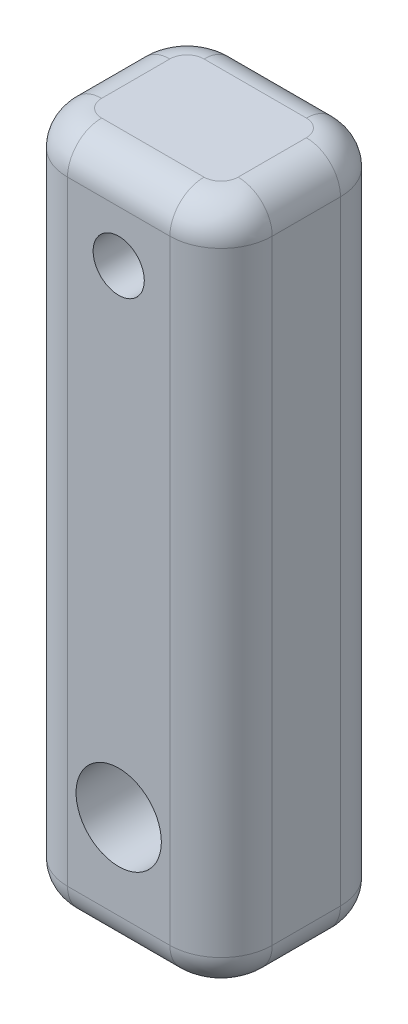
ISO-10303-21;
HEADER;
FILE_DESCRIPTION(('STEP AP214'),'2;1');
FILE_NAME('part.step','',(''),(''),'','','');
FILE_SCHEMA(('AUTOMOTIVE_DESIGN { 1 0 10303 214 1 1 1 1 }'));
ENDSEC;
DATA;
#1=APPLICATION_CONTEXT('core data for automotive mechanical design processes');
#2=APPLICATION_PROTOCOL_DEFINITION('international standard','automotive_design',2000,#1);
#3=PRODUCT_CONTEXT('',#1,'mechanical');
#4=PRODUCT('Part','Part','',(#3));
#5=PRODUCT_RELATED_PRODUCT_CATEGORY('part','',(#4));
#6=PRODUCT_DEFINITION_FORMATION('','',#4);
#7=PRODUCT_DEFINITION_CONTEXT('part definition',#1,'design');
#8=PRODUCT_DEFINITION('design','',#6,#7);
#9=PRODUCT_DEFINITION_SHAPE('','',#8);
#10=(LENGTH_UNIT() NAMED_UNIT(*) SI_UNIT(.MILLI.,.METRE.));
#11=(NAMED_UNIT(*) PLANE_ANGLE_UNIT() SI_UNIT($,.RADIAN.));
#12=(NAMED_UNIT(*) SI_UNIT($,.STERADIAN.) SOLID_ANGLE_UNIT());
#13=UNCERTAINTY_MEASURE_WITH_UNIT(LENGTH_MEASURE(1.E-05),#10,'distance_accuracy_value','');
#14=(GEOMETRIC_REPRESENTATION_CONTEXT(3) GLOBAL_UNCERTAINTY_ASSIGNED_CONTEXT((#13)) GLOBAL_UNIT_ASSIGNED_CONTEXT((#10,
#11,#12)) REPRESENTATION_CONTEXT('',''));
#15=CARTESIAN_POINT('',(0.,0.,0.));
#16=DIRECTION('',(0.,0.,1.));
#17=DIRECTION('',(1.,0.,0.));
#18=AXIS2_PLACEMENT_3D('',#15,#16,#17);
#19=CARTESIAN_POINT('',(-7.62,101.6,5.08));
#20=DIRECTION('',(0.,-1.,0.));
#21=DIRECTION('',(0.,0.,-1.));
#22=AXIS2_PLACEMENT_3D('',#19,#20,#21);
#23=CYLINDRICAL_SURFACE('',#22,7.62);
#24=DIRECTION('',(0.,-1.,0.));
#25=VECTOR('',#24,1.);
#26=CARTESIAN_POINT('',(-7.62,101.6,12.7));
#27=LINE('',#26,#25);
#28=CARTESIAN_POINT('',(-7.62,96.5199999999999,12.7));
#29=VERTEX_POINT('',#28);
#30=CARTESIAN_POINT('',(-7.62,5.07999999999997,12.7));
#31=VERTEX_POINT('',#30);
#32=EDGE_CURVE('E158',#29,#31,#27,.T.);
#33=ORIENTED_EDGE('',*,*,#32,.F.);
#34=CARTESIAN_POINT('',(-7.62,96.5199999999999,5.08));
#35=DIRECTION('',(0.,1.,0.));
#36=DIRECTION('',(0.,0.,1.));
#37=AXIS2_PLACEMENT_3D('',#34,#35,#36);
#38=CIRCLE('',#37,7.62);
#39=CARTESIAN_POINT('',(-15.24,96.5199999999999,5.08));
#40=VERTEX_POINT('',#39);
#41=EDGE_CURVE('E13',#29,#40,#38,.F.);
#42=ORIENTED_EDGE('',*,*,#41,.T.);
#43=DIRECTION('',(0.,-1.,0.));
#44=VECTOR('',#43,1.);
#45=CARTESIAN_POINT('',(-15.24,101.6,5.08));
#46=LINE('',#45,#44);
#47=CARTESIAN_POINT('',(-15.24,5.07999999999997,5.08));
#48=VERTEX_POINT('',#47);
#49=EDGE_CURVE('E189',#40,#48,#46,.T.);
#50=ORIENTED_EDGE('',*,*,#49,.T.);
#51=CARTESIAN_POINT('',(-7.62,5.07999999999997,5.08));
#52=DIRECTION('',(0.,1.,0.));
#53=DIRECTION('',(0.,0.,1.));
#54=AXIS2_PLACEMENT_3D('',#51,#52,#53);
#55=CIRCLE('',#54,7.62);
#56=EDGE_CURVE('E167',#48,#31,#55,.T.);
#57=ORIENTED_EDGE('',*,*,#56,.T.);
#58=EDGE_LOOP('',(#33,#42,#50,#57));
#59=FACE_BOUND('',#58,.T.);
#60=ADVANCED_FACE('F46',(#59),#23,.T.);
#61=CARTESIAN_POINT('',(-7.62,101.6,12.7));
#62=DIRECTION('',(0.,0.,-1.));
#63=DIRECTION('',(-1.,0.,0.));
#64=AXIS2_PLACEMENT_3D('',#61,#62,#63);
#65=PLANE('',#64);
#66=CARTESIAN_POINT('',(0.,88.8999999999999,12.7));
#67=DIRECTION('',(0.,0.,1.));
#68=DIRECTION('',(1.,0.,0.));
#69=AXIS2_PLACEMENT_3D('',#66,#67,#68);
#70=CIRCLE('',#69,3.81);
#71=CARTESIAN_POINT('',(3.81,88.8999999999999,12.7));
#72=VERTEX_POINT('',#71);
#73=EDGE_CURVE('E243',#72,#72,#70,.T.);
#74=ORIENTED_EDGE('',*,*,#73,.F.);
#75=EDGE_LOOP('',(#74));
#76=FACE_BOUND('',#75,.T.);
#77=CARTESIAN_POINT('',(0.,17.78,12.7));
#78=DIRECTION('',(0.,0.,1.));
#79=DIRECTION('',(1.,0.,0.));
#80=AXIS2_PLACEMENT_3D('',#77,#78,#79);
#81=CIRCLE('',#80,6.35);
#82=CARTESIAN_POINT('',(6.35,17.78,12.7));
#83=VERTEX_POINT('',#82);
#84=EDGE_CURVE('E321',#83,#83,#81,.T.);
#85=ORIENTED_EDGE('',*,*,#84,.F.);
#86=EDGE_LOOP('',(#85));
#87=FACE_BOUND('',#86,.T.);
#88=DIRECTION('',(0.,-1.,0.));
#89=VECTOR('',#88,1.);
#90=CARTESIAN_POINT('',(7.61999999999999,101.6,12.7));
#91=LINE('',#90,#89);
#92=CARTESIAN_POINT('',(7.61999999999999,96.5199999999999,12.7));
#93=VERTEX_POINT('',#92);
#94=CARTESIAN_POINT('',(7.61999999999999,5.07999999999997,12.7));
#95=VERTEX_POINT('',#94);
#96=EDGE_CURVE('E168',#93,#95,#91,.T.);
#97=ORIENTED_EDGE('',*,*,#96,.F.);
#98=DIRECTION('',(1.,0.,0.));
#99=VECTOR('',#98,1.);
#100=CARTESIAN_POINT('',(-7.62,96.5199999999999,12.7));
#101=LINE('',#100,#99);
#102=EDGE_CURVE('E55',#93,#29,#101,.F.);
#103=ORIENTED_EDGE('',*,*,#102,.T.);
#104=ORIENTED_EDGE('',*,*,#32,.T.);
#105=DIRECTION('',(1.,0.,0.));
#106=VECTOR('',#105,1.);
#107=CARTESIAN_POINT('',(-7.62,5.07999999999997,12.7));
#108=LINE('',#107,#106);
#109=EDGE_CURVE('E162',#31,#95,#108,.T.);
#110=ORIENTED_EDGE('',*,*,#109,.T.);
#111=EDGE_LOOP('',(#97,#103,#104,#110));
#112=FACE_BOUND('',#111,.T.);
#113=ADVANCED_FACE('F160',(#76,#87,#112),#65,.F.);
#114=CARTESIAN_POINT('',(7.61999999999999,101.6,5.08));
#115=DIRECTION('',(0.,-1.,0.));
#116=DIRECTION('',(0.,0.,-1.));
#117=AXIS2_PLACEMENT_3D('',#114,#115,#116);
#118=CYLINDRICAL_SURFACE('',#117,7.62);
#119=DIRECTION('',(0.,-1.,0.));
#120=VECTOR('',#119,1.);
#121=CARTESIAN_POINT('',(15.24,101.6,5.08));
#122=LINE('',#121,#120);
#123=CARTESIAN_POINT('',(15.24,96.5199999999999,5.08));
#124=VERTEX_POINT('',#123);
#125=CARTESIAN_POINT('',(15.24,5.07999999999997,5.08));
#126=VERTEX_POINT('',#125);
#127=EDGE_CURVE('E306',#124,#126,#122,.T.);
#128=ORIENTED_EDGE('',*,*,#127,.F.);
#129=CARTESIAN_POINT('',(7.61999999999999,96.5199999999999,5.08));
#130=DIRECTION('',(0.,1.,0.));
#131=DIRECTION('',(0.,0.,1.));
#132=AXIS2_PLACEMENT_3D('',#129,#130,#131);
#133=CIRCLE('',#132,7.62);
#134=EDGE_CURVE('E70',#124,#93,#133,.F.);
#135=ORIENTED_EDGE('',*,*,#134,.T.);
#136=ORIENTED_EDGE('',*,*,#96,.T.);
#137=CARTESIAN_POINT('',(7.61999999999999,5.07999999999997,5.08));
#138=DIRECTION('',(0.,1.,0.));
#139=DIRECTION('',(0.,0.,1.));
#140=AXIS2_PLACEMENT_3D('',#137,#138,#139);
#141=CIRCLE('',#140,7.62);
#142=EDGE_CURVE('E186',#95,#126,#141,.T.);
#143=ORIENTED_EDGE('',*,*,#142,.T.);
#144=EDGE_LOOP('',(#128,#135,#136,#143));
#145=FACE_BOUND('',#144,.T.);
#146=ADVANCED_FACE('F308',(#145),#118,.T.);
#147=CARTESIAN_POINT('',(15.24,101.6,-5.08));
#148=DIRECTION('',(-1.,0.,0.));
#149=DIRECTION('',(0.,0.,1.));
#150=AXIS2_PLACEMENT_3D('',#147,#148,#149);
#151=PLANE('',#150);
#152=DIRECTION('',(0.,-1.,0.));
#153=VECTOR('',#152,1.);
#154=CARTESIAN_POINT('',(15.24,101.6,-5.08));
#155=LINE('',#154,#153);
#156=CARTESIAN_POINT('',(15.24,96.5199999999999,-5.08));
#157=VERTEX_POINT('',#156);
#158=CARTESIAN_POINT('',(15.24,5.07999999999997,-5.08));
#159=VERTEX_POINT('',#158);
#160=EDGE_CURVE('E307',#157,#159,#155,.T.);
#161=ORIENTED_EDGE('',*,*,#160,.F.);
#162=DIRECTION('',(0.,0.,-1.));
#163=VECTOR('',#162,1.);
#164=CARTESIAN_POINT('',(15.24,96.5199999999999,5.08));
#165=LINE('',#164,#163);
#166=EDGE_CURVE('E269',#157,#124,#165,.F.);
#167=ORIENTED_EDGE('',*,*,#166,.T.);
#168=ORIENTED_EDGE('',*,*,#127,.T.);
#169=DIRECTION('',(0.,0.,-1.));
#170=VECTOR('',#169,1.);
#171=CARTESIAN_POINT('',(15.24,5.07999999999997,-5.08));
#172=LINE('',#171,#170);
#173=EDGE_CURVE('E211',#126,#159,#172,.T.);
#174=ORIENTED_EDGE('',*,*,#173,.T.);
#175=EDGE_LOOP('',(#161,#167,#168,#174));
#176=FACE_BOUND('',#175,.T.);
#177=ADVANCED_FACE('F305',(#176),#151,.F.);
#178=CARTESIAN_POINT('',(7.61999999999999,101.6,-5.08));
#179=DIRECTION('',(0.,-1.,0.));
#180=DIRECTION('',(0.,0.,-1.));
#181=AXIS2_PLACEMENT_3D('',#178,#179,#180);
#182=CYLINDRICAL_SURFACE('',#181,7.62);
#183=DIRECTION('',(0.,-1.,0.));
#184=VECTOR('',#183,1.);
#185=CARTESIAN_POINT('',(7.61999999999999,101.6,-12.7));
#186=LINE('',#185,#184);
#187=CARTESIAN_POINT('',(7.61999999999999,96.5199999999999,-12.7));
#188=VERTEX_POINT('',#187);
#189=CARTESIAN_POINT('',(7.61999999999999,5.07999999999997,-12.7));
#190=VERTEX_POINT('',#189);
#191=EDGE_CURVE('E311',#188,#190,#186,.T.);
#192=ORIENTED_EDGE('',*,*,#191,.F.);
#193=CARTESIAN_POINT('',(7.61999999999999,96.5199999999999,-5.08));
#194=DIRECTION('',(0.,1.,0.));
#195=DIRECTION('',(0.,0.,1.));
#196=AXIS2_PLACEMENT_3D('',#193,#194,#195);
#197=CIRCLE('',#196,7.62);
#198=EDGE_CURVE('E267',#188,#157,#197,.F.);
#199=ORIENTED_EDGE('',*,*,#198,.T.);
#200=ORIENTED_EDGE('',*,*,#160,.T.);
#201=CARTESIAN_POINT('',(7.61999999999999,5.07999999999997,-5.08));
#202=DIRECTION('',(0.,1.,0.));
#203=DIRECTION('',(0.,0.,1.));
#204=AXIS2_PLACEMENT_3D('',#201,#202,#203);
#205=CIRCLE('',#204,7.62);
#206=EDGE_CURVE('E222',#159,#190,#205,.T.);
#207=ORIENTED_EDGE('',*,*,#206,.T.);
#208=EDGE_LOOP('',(#192,#199,#200,#207));
#209=FACE_BOUND('',#208,.T.);
#210=ADVANCED_FACE('F492',(#209),#182,.T.);
#211=CARTESIAN_POINT('',(-7.62,101.6,-12.7));
#212=DIRECTION('',(0.,0.,1.));
#213=DIRECTION('',(1.,0.,0.));
#214=AXIS2_PLACEMENT_3D('',#211,#212,#213);
#215=PLANE('',#214);
#216=CARTESIAN_POINT('',(0.,88.8999999999999,-12.7));
#217=DIRECTION('',(0.,0.,1.));
#218=DIRECTION('',(1.,0.,0.));
#219=AXIS2_PLACEMENT_3D('',#216,#217,#218);
#220=CIRCLE('',#219,3.81);
#221=CARTESIAN_POINT('',(3.81,88.8999999999999,-12.7));
#222=VERTEX_POINT('',#221);
#223=EDGE_CURVE('E324',#222,#222,#220,.T.);
#224=ORIENTED_EDGE('',*,*,#223,.T.);
#225=EDGE_LOOP('',(#224));
#226=FACE_BOUND('',#225,.T.);
#227=CARTESIAN_POINT('',(0.,17.78,-12.7));
#228=DIRECTION('',(0.,0.,1.));
#229=DIRECTION('',(1.,0.,0.));
#230=AXIS2_PLACEMENT_3D('',#227,#228,#229);
#231=CIRCLE('',#230,6.35);
#232=CARTESIAN_POINT('',(6.35,17.78,-12.7));
#233=VERTEX_POINT('',#232);
#234=EDGE_CURVE('E320',#233,#233,#231,.T.);
#235=ORIENTED_EDGE('',*,*,#234,.T.);
#236=EDGE_LOOP('',(#235));
#237=FACE_BOUND('',#236,.T.);
#238=DIRECTION('',(0.,-1.,0.));
#239=VECTOR('',#238,1.);
#240=CARTESIAN_POINT('',(-7.62,101.6,-12.7));
#241=LINE('',#240,#239);
#242=CARTESIAN_POINT('',(-7.62,96.5199999999999,-12.7));
#243=VERTEX_POINT('',#242);
#244=CARTESIAN_POINT('',(-7.62,5.07999999999997,-12.7));
#245=VERTEX_POINT('',#244);
#246=EDGE_CURVE('E315',#243,#245,#241,.T.);
#247=ORIENTED_EDGE('',*,*,#246,.F.);
#248=DIRECTION('',(-1.,0.,0.));
#249=VECTOR('',#248,1.);
#250=CARTESIAN_POINT('',(7.61999999999999,96.5199999999999,-12.7));
#251=LINE('',#250,#249);
#252=EDGE_CURVE('E265',#243,#188,#251,.F.);
#253=ORIENTED_EDGE('',*,*,#252,.T.);
#254=ORIENTED_EDGE('',*,*,#191,.T.);
#255=DIRECTION('',(-1.,0.,0.));
#256=VECTOR('',#255,1.);
#257=CARTESIAN_POINT('',(-7.62,5.07999999999997,-12.7));
#258=LINE('',#257,#256);
#259=EDGE_CURVE('E219',#190,#245,#258,.T.);
#260=ORIENTED_EDGE('',*,*,#259,.T.);
#261=EDGE_LOOP('',(#247,#253,#254,#260));
#262=FACE_BOUND('',#261,.T.);
#263=ADVANCED_FACE('F332',(#226,#237,#262),#215,.F.);
#264=CARTESIAN_POINT('',(-7.62,101.6,-5.08));
#265=DIRECTION('',(0.,-1.,0.));
#266=DIRECTION('',(0.,0.,-1.));
#267=AXIS2_PLACEMENT_3D('',#264,#265,#266);
#268=CYLINDRICAL_SURFACE('',#267,7.62);
#269=DIRECTION('',(0.,-1.,0.));
#270=VECTOR('',#269,1.);
#271=CARTESIAN_POINT('',(-15.24,101.6,-5.08));
#272=LINE('',#271,#270);
#273=CARTESIAN_POINT('',(-15.24,96.5199999999999,-5.08));
#274=VERTEX_POINT('',#273);
#275=CARTESIAN_POINT('',(-15.24,5.07999999999997,-5.08));
#276=VERTEX_POINT('',#275);
#277=EDGE_CURVE('E317',#274,#276,#272,.T.);
#278=ORIENTED_EDGE('',*,*,#277,.F.);
#279=CARTESIAN_POINT('',(-7.62,96.5199999999999,-5.08));
#280=DIRECTION('',(0.,1.,0.));
#281=DIRECTION('',(0.,0.,1.));
#282=AXIS2_PLACEMENT_3D('',#279,#280,#281);
#283=CIRCLE('',#282,7.62);
#284=EDGE_CURVE('E263',#274,#243,#283,.F.);
#285=ORIENTED_EDGE('',*,*,#284,.T.);
#286=ORIENTED_EDGE('',*,*,#246,.T.);
#287=CARTESIAN_POINT('',(-7.62,5.07999999999997,-5.08));
#288=DIRECTION('',(0.,1.,0.));
#289=DIRECTION('',(0.,0.,1.));
#290=AXIS2_PLACEMENT_3D('',#287,#288,#289);
#291=CIRCLE('',#290,7.62);
#292=EDGE_CURVE('E216',#245,#276,#291,.T.);
#293=ORIENTED_EDGE('',*,*,#292,.T.);
#294=EDGE_LOOP('',(#278,#285,#286,#293));
#295=FACE_BOUND('',#294,.T.);
#296=ADVANCED_FACE('F477',(#295),#268,.T.);
#297=CARTESIAN_POINT('',(-15.24,101.6,-5.08));
#298=DIRECTION('',(1.,0.,0.));
#299=DIRECTION('',(0.,0.,-1.));
#300=AXIS2_PLACEMENT_3D('',#297,#298,#299);
#301=PLANE('',#300);
#302=ORIENTED_EDGE('',*,*,#49,.F.);
#303=DIRECTION('',(0.,0.,1.));
#304=VECTOR('',#303,1.);
#305=CARTESIAN_POINT('',(-15.24,96.5199999999999,-5.08));
#306=LINE('',#305,#304);
#307=EDGE_CURVE('E260',#40,#274,#306,.F.);
#308=ORIENTED_EDGE('',*,*,#307,.T.);
#309=ORIENTED_EDGE('',*,*,#277,.T.);
#310=DIRECTION('',(0.,0.,1.));
#311=VECTOR('',#310,1.);
#312=CARTESIAN_POINT('',(-15.24,5.07999999999997,-5.08));
#313=LINE('',#312,#311);
#314=EDGE_CURVE('E214',#276,#48,#313,.T.);
#315=ORIENTED_EDGE('',*,*,#314,.T.);
#316=EDGE_LOOP('',(#302,#308,#309,#315));
#317=FACE_BOUND('',#316,.T.);
#318=ADVANCED_FACE('F470',(#317),#301,.F.);
#319=CARTESIAN_POINT('',(-7.62,101.6,5.08));
#320=DIRECTION('',(0.,1.,0.));
#321=DIRECTION('',(0.,0.,1.));
#322=AXIS2_PLACEMENT_3D('',#319,#320,#321);
#323=PLANE('',#322);
#324=CARTESIAN_POINT('',(-7.62,101.6,-5.08));
#325=DIRECTION('',(0.,1.,0.));
#326=DIRECTION('',(0.,0.,1.));
#327=AXIS2_PLACEMENT_3D('',#324,#325,#326);
#328=CIRCLE('',#327,2.54);
#329=CARTESIAN_POINT('',(-7.62,101.6,-7.62));
#330=VERTEX_POINT('',#329);
#331=CARTESIAN_POINT('',(-10.16,101.6,-5.08));
#332=VERTEX_POINT('',#331);
#333=EDGE_CURVE('E255',#330,#332,#328,.T.);
#334=ORIENTED_EDGE('',*,*,#333,.T.);
#335=DIRECTION('',(0.,0.,1.));
#336=VECTOR('',#335,1.);
#337=CARTESIAN_POINT('',(-10.16,101.6,5.08));
#338=LINE('',#337,#336);
#339=CARTESIAN_POINT('',(-10.16,101.6,5.08));
#340=VERTEX_POINT('',#339);
#341=EDGE_CURVE('E257',#332,#340,#338,.T.);
#342=ORIENTED_EDGE('',*,*,#341,.T.);
#343=CARTESIAN_POINT('',(-7.62,101.6,5.08));
#344=DIRECTION('',(0.,1.,0.));
#345=DIRECTION('',(0.,0.,1.));
#346=AXIS2_PLACEMENT_3D('',#343,#344,#345);
#347=CIRCLE('',#346,2.54);
#348=CARTESIAN_POINT('',(-7.62,101.6,7.62));
#349=VERTEX_POINT('',#348);
#350=EDGE_CURVE('E224',#340,#349,#347,.T.);
#351=ORIENTED_EDGE('',*,*,#350,.T.);
#352=DIRECTION('',(1.,0.,0.));
#353=VECTOR('',#352,1.);
#354=CARTESIAN_POINT('',(7.61999999999999,101.6,7.62));
#355=LINE('',#354,#353);
#356=CARTESIAN_POINT('',(7.61999999999999,101.6,7.62));
#357=VERTEX_POINT('',#356);
#358=EDGE_CURVE('E245',#349,#357,#355,.T.);
#359=ORIENTED_EDGE('',*,*,#358,.T.);
#360=CARTESIAN_POINT('',(7.61999999999999,101.6,5.08));
#361=DIRECTION('',(0.,1.,0.));
#362=DIRECTION('',(0.,0.,1.));
#363=AXIS2_PLACEMENT_3D('',#360,#361,#362);
#364=CIRCLE('',#363,2.54);
#365=CARTESIAN_POINT('',(10.16,101.6,5.08));
#366=VERTEX_POINT('',#365);
#367=EDGE_CURVE('E247',#357,#366,#364,.T.);
#368=ORIENTED_EDGE('',*,*,#367,.T.);
#369=DIRECTION('',(0.,0.,-1.));
#370=VECTOR('',#369,1.);
#371=CARTESIAN_POINT('',(10.16,101.6,-5.08));
#372=LINE('',#371,#370);
#373=CARTESIAN_POINT('',(10.16,101.6,-5.08));
#374=VERTEX_POINT('',#373);
#375=EDGE_CURVE('E249',#366,#374,#372,.T.);
#376=ORIENTED_EDGE('',*,*,#375,.T.);
#377=CARTESIAN_POINT('',(7.61999999999999,101.6,-5.08));
#378=DIRECTION('',(0.,1.,0.));
#379=DIRECTION('',(0.,0.,1.));
#380=AXIS2_PLACEMENT_3D('',#377,#378,#379);
#381=CIRCLE('',#380,2.54);
#382=CARTESIAN_POINT('',(7.61999999999999,101.6,-7.62));
#383=VERTEX_POINT('',#382);
#384=EDGE_CURVE('E251',#374,#383,#381,.T.);
#385=ORIENTED_EDGE('',*,*,#384,.T.);
#386=DIRECTION('',(-1.,0.,0.));
#387=VECTOR('',#386,1.);
#388=CARTESIAN_POINT('',(-7.62,101.6,-7.62));
#389=LINE('',#388,#387);
#390=EDGE_CURVE('E253',#383,#330,#389,.T.);
#391=ORIENTED_EDGE('',*,*,#390,.T.);
#392=EDGE_LOOP('',(#334,#342,#351,#359,#368,#376,#385,#391));
#393=FACE_BOUND('',#392,.T.);
#394=ADVANCED_FACE('F355',(#393),#323,.T.);
#395=CARTESIAN_POINT('',(-7.62,0.,5.08));
#396=DIRECTION('',(0.,1.,0.));
#397=DIRECTION('',(0.,0.,1.));
#398=AXIS2_PLACEMENT_3D('',#395,#396,#397);
#399=PLANE('',#398);
#400=DIRECTION('',(1.,0.,0.));
#401=VECTOR('',#400,1.);
#402=CARTESIAN_POINT('',(-7.62,0.,7.62));
#403=LINE('',#402,#401);
#404=CARTESIAN_POINT('',(7.61999999999999,0.,7.61999999999999));
#405=VERTEX_POINT('',#404);
#406=CARTESIAN_POINT('',(-7.62,0.,7.62));
#407=VERTEX_POINT('',#406);
#408=EDGE_CURVE('E206',#405,#407,#403,.F.);
#409=ORIENTED_EDGE('',*,*,#408,.T.);
#410=CARTESIAN_POINT('',(-7.62,0.,5.08));
#411=DIRECTION('',(0.,1.,0.));
#412=DIRECTION('',(0.,0.,1.));
#413=AXIS2_PLACEMENT_3D('',#410,#411,#412);
#414=CIRCLE('',#413,2.54);
#415=CARTESIAN_POINT('',(-10.16,0.,5.08));
#416=VERTEX_POINT('',#415);
#417=EDGE_CURVE('E177',#407,#416,#414,.F.);
#418=ORIENTED_EDGE('',*,*,#417,.T.);
#419=DIRECTION('',(0.,0.,1.));
#420=VECTOR('',#419,1.);
#421=CARTESIAN_POINT('',(-10.16,0.,5.08));
#422=LINE('',#421,#420);
#423=CARTESIAN_POINT('',(-10.16,0.,-5.08));
#424=VERTEX_POINT('',#423);
#425=EDGE_CURVE('E200',#416,#424,#422,.F.);
#426=ORIENTED_EDGE('',*,*,#425,.T.);
#427=CARTESIAN_POINT('',(-7.62,0.,-5.08));
#428=DIRECTION('',(0.,1.,0.));
#429=DIRECTION('',(0.,0.,1.));
#430=AXIS2_PLACEMENT_3D('',#427,#428,#429);
#431=CIRCLE('',#430,2.54);
#432=CARTESIAN_POINT('',(-7.62,0.,-7.62));
#433=VERTEX_POINT('',#432);
#434=EDGE_CURVE('E198',#424,#433,#431,.F.);
#435=ORIENTED_EDGE('',*,*,#434,.T.);
#436=DIRECTION('',(-1.,0.,0.));
#437=VECTOR('',#436,1.);
#438=CARTESIAN_POINT('',(-7.62,0.,-7.62));
#439=LINE('',#438,#437);
#440=CARTESIAN_POINT('',(7.61999999999999,0.,-7.62));
#441=VERTEX_POINT('',#440);
#442=EDGE_CURVE('E193',#433,#441,#439,.F.);
#443=ORIENTED_EDGE('',*,*,#442,.T.);
#444=CARTESIAN_POINT('',(7.61999999999999,0.,-5.08));
#445=DIRECTION('',(0.,1.,0.));
#446=DIRECTION('',(0.,0.,1.));
#447=AXIS2_PLACEMENT_3D('',#444,#445,#446);
#448=CIRCLE('',#447,2.54);
#449=CARTESIAN_POINT('',(10.16,0.,-5.08));
#450=VERTEX_POINT('',#449);
#451=EDGE_CURVE('E191',#441,#450,#448,.F.);
#452=ORIENTED_EDGE('',*,*,#451,.T.);
#453=DIRECTION('',(0.,0.,-1.));
#454=VECTOR('',#453,1.);
#455=CARTESIAN_POINT('',(10.16,0.,5.08));
#456=LINE('',#455,#454);
#457=CARTESIAN_POINT('',(10.16,0.,5.08));
#458=VERTEX_POINT('',#457);
#459=EDGE_CURVE('E202',#450,#458,#456,.F.);
#460=ORIENTED_EDGE('',*,*,#459,.T.);
#461=CARTESIAN_POINT('',(7.61999999999999,0.,5.08));
#462=DIRECTION('',(0.,1.,0.));
#463=DIRECTION('',(0.,0.,1.));
#464=AXIS2_PLACEMENT_3D('',#461,#462,#463);
#465=CIRCLE('',#464,2.54);
#466=EDGE_CURVE('E204',#458,#405,#465,.F.);
#467=ORIENTED_EDGE('',*,*,#466,.T.);
#468=EDGE_LOOP('',(#409,#418,#426,#435,#443,#452,#460,#467));
#469=FACE_BOUND('',#468,.T.);
#470=ADVANCED_FACE('F349',(#469),#399,.F.);
#471=CARTESIAN_POINT('',(0.,17.78,-12.7));
#472=DIRECTION('',(0.,0.,1.));
#473=DIRECTION('',(1.,0.,0.));
#474=AXIS2_PLACEMENT_3D('',#471,#472,#473);
#475=CYLINDRICAL_SURFACE('',#474,6.35);
#476=CARTESIAN_POINT('',(6.35,17.78,-12.7));
#477=CARTESIAN_POINT('',(6.35,17.78,-12.4354166666667));
#478=CARTESIAN_POINT('',(6.35,17.78,-12.1708333333333));
#479=CARTESIAN_POINT('',(6.35,17.78,-11.6416666666667));
#480=CARTESIAN_POINT('',(6.35,17.78,-11.3770833333333));
#481=CARTESIAN_POINT('',(6.35,17.78,-10.8479166666667));
#482=CARTESIAN_POINT('',(6.35,17.78,-10.5833333333333));
#483=CARTESIAN_POINT('',(6.35,17.78,-10.0541666666667));
#484=CARTESIAN_POINT('',(6.35,17.78,-9.78958333333334));
#485=CARTESIAN_POINT('',(6.35,17.78,-9.26041666666667));
#486=CARTESIAN_POINT('',(6.35,17.78,-8.99583333333334));
#487=CARTESIAN_POINT('',(6.35,17.78,-8.46666666666667));
#488=CARTESIAN_POINT('',(6.35,17.78,-8.20208333333334));
#489=CARTESIAN_POINT('',(6.35,17.78,-7.67291666666667));
#490=CARTESIAN_POINT('',(6.35,17.78,-7.40833333333334));
#491=CARTESIAN_POINT('',(6.35,17.78,-6.87916666666667));
#492=CARTESIAN_POINT('',(6.35,17.78,-6.61458333333334));
#493=CARTESIAN_POINT('',(6.35,17.78,-6.08541666666667));
#494=CARTESIAN_POINT('',(6.35,17.78,-5.82083333333334));
#495=CARTESIAN_POINT('',(6.35,17.78,-5.29166666666667));
#496=CARTESIAN_POINT('',(6.35,17.78,-5.02708333333334));
#497=CARTESIAN_POINT('',(6.35,17.78,-4.49791666666667));
#498=CARTESIAN_POINT('',(6.35,17.78,-4.23333333333334));
#499=CARTESIAN_POINT('',(6.35,17.78,-3.70416666666667));
#500=CARTESIAN_POINT('',(6.35,17.78,-3.43958333333334));
#501=CARTESIAN_POINT('',(6.35,17.78,-2.91041666666667));
#502=CARTESIAN_POINT('',(6.35,17.78,-2.64583333333334));
#503=CARTESIAN_POINT('',(6.35,17.78,-2.11666666666667));
#504=CARTESIAN_POINT('',(6.35,17.78,-1.85208333333334));
#505=CARTESIAN_POINT('',(6.35,17.78,-1.32291666666667));
#506=CARTESIAN_POINT('',(6.35,17.78,-1.05833333333334));
#507=CARTESIAN_POINT('',(6.35,17.78,-0.52916666666667));
#508=CARTESIAN_POINT('',(6.35,17.78,-0.264583333333337));
#509=CARTESIAN_POINT('',(6.35,17.78,0.26458333333333));
#510=CARTESIAN_POINT('',(6.35,17.78,0.529166666666663));
#511=CARTESIAN_POINT('',(6.35,17.78,1.05833333333333));
#512=CARTESIAN_POINT('',(6.35,17.78,1.32291666666666));
#513=CARTESIAN_POINT('',(6.35,17.78,1.85208333333333));
#514=CARTESIAN_POINT('',(6.35,17.78,2.11666666666666));
#515=CARTESIAN_POINT('',(6.35,17.78,2.64583333333333));
#516=CARTESIAN_POINT('',(6.35,17.78,2.91041666666666));
#517=CARTESIAN_POINT('',(6.35,17.78,3.43958333333333));
#518=CARTESIAN_POINT('',(6.35,17.78,3.70416666666666));
#519=CARTESIAN_POINT('',(6.35,17.78,4.23333333333333));
#520=CARTESIAN_POINT('',(6.35,17.78,4.49791666666667));
#521=CARTESIAN_POINT('',(6.35,17.78,5.02708333333333));
#522=CARTESIAN_POINT('',(6.35,17.78,5.29166666666667));
#523=CARTESIAN_POINT('',(6.35,17.78,5.82083333333333));
#524=CARTESIAN_POINT('',(6.35,17.78,6.08541666666667));
#525=CARTESIAN_POINT('',(6.35,17.78,6.61458333333333));
#526=CARTESIAN_POINT('',(6.35,17.78,6.87916666666666));
#527=CARTESIAN_POINT('',(6.35,17.78,7.40833333333333));
#528=CARTESIAN_POINT('',(6.35,17.78,7.67291666666666));
#529=CARTESIAN_POINT('',(6.35,17.78,8.20208333333333));
#530=CARTESIAN_POINT('',(6.35,17.78,8.46666666666667));
#531=CARTESIAN_POINT('',(6.35,17.78,8.99583333333333));
#532=CARTESIAN_POINT('',(6.35,17.78,9.26041666666666));
#533=CARTESIAN_POINT('',(6.35,17.78,9.78958333333333));
#534=CARTESIAN_POINT('',(6.35,17.78,10.0541666666667));
#535=CARTESIAN_POINT('',(6.35,17.78,10.5833333333333));
#536=CARTESIAN_POINT('',(6.35,17.78,10.8479166666667));
#537=CARTESIAN_POINT('',(6.35,17.78,11.3770833333333));
#538=CARTESIAN_POINT('',(6.35,17.78,11.6416666666667));
#539=CARTESIAN_POINT('',(6.35,17.78,12.1708333333333));
#540=CARTESIAN_POINT('',(6.35,17.78,12.4354166666667));
#541=CARTESIAN_POINT('',(6.35,17.78,12.7));
#542=B_SPLINE_CURVE_WITH_KNOTS('',3,(#476,#477,#478,#479,#480,#481,#482,#483,#484,#485,#486,
#487,#488,#489,#490,#491,#492,#493,#494,#495,#496,#497,#498,#499,#500,#501,#502,#503,#504,#505,
#506,#507,#508,#509,#510,#511,#512,#513,#514,#515,#516,#517,#518,#519,#520,#521,#522,#523,#524,
#525,#526,#527,#528,#529,#530,#531,#532,#533,#534,#535,#536,#537,#538,#539,#540,#541),
.UNSPECIFIED.,.F.,.F.,(4,2,2,2,2,2,2,2,2,2,2,2,2,2,2,2,2,2,2,2,2,2,2,2,2,2,2,2,2,2,2,2,4),(0.,
0.793750000000001,1.5875,2.38125,3.175,3.96875,4.7625,5.55625,6.35,7.14375,7.9375,8.73125,9.525,
10.31875,11.1125,11.90625,12.7,13.49375,14.2875,15.08125,15.875,16.66875,17.4625,18.25625,19.05,
19.84375,20.6375,21.43125,22.225,23.01875,23.8125,24.60625,25.4),.UNSPECIFIED.);
#543=EDGE_CURVE('BSEAM339',#233,#83,#542,.T.);
#544=ORIENTED_EDGE('',*,*,#234,.F.);
#545=ORIENTED_EDGE('',*,*,#84,.T.);
#546=ORIENTED_EDGE('',*,*,#543,.T.);
#547=ORIENTED_EDGE('',*,*,#543,.F.);
#548=EDGE_LOOP('',(#544,#546,#545,#547));
#549=FACE_BOUND('',#548,.T.);
#550=ADVANCED_FACE('F339',(#549),#475,.F.);
#551=CARTESIAN_POINT('',(0.,88.8999999999999,-12.7));
#552=DIRECTION('',(0.,0.,1.));
#553=DIRECTION('',(1.,0.,0.));
#554=AXIS2_PLACEMENT_3D('',#551,#552,#553);
#555=CYLINDRICAL_SURFACE('',#554,3.81);
#556=ORIENTED_EDGE('',*,*,#223,.F.);
#557=EDGE_LOOP('',(#556));
#558=FACE_BOUND('',#557,.T.);
#559=ORIENTED_EDGE('',*,*,#73,.T.);
#560=EDGE_LOOP('',(#559));
#561=FACE_BOUND('',#560,.T.);
#562=ADVANCED_FACE('F335',(#558,#561),#555,.F.);
#563=CARTESIAN_POINT('',(7.61999999999999,5.07999999999997,-5.08));
#564=DIRECTION('',(0.,1.,0.));
#565=DIRECTION('',(0.,0.,1.));
#566=AXIS2_PLACEMENT_3D('',#563,#564,#565);
#567=DEGENERATE_TOROIDAL_SURFACE('',#566,2.54,5.08,.T.);
#568=CARTESIAN_POINT('',(10.16,5.07999999999997,-5.08));
#569=DIRECTION('',(0.,0.,1.));
#570=DIRECTION('',(1.,0.,0.));
#571=AXIS2_PLACEMENT_3D('',#568,#569,#570);
#572=CIRCLE('',#571,5.08);
#573=EDGE_CURVE('E237',#450,#159,#572,.T.);
#574=ORIENTED_EDGE('',*,*,#573,.F.);
#575=ORIENTED_EDGE('',*,*,#451,.F.);
#576=CARTESIAN_POINT('',(7.61999999999999,5.07999999999997,-7.62));
#577=DIRECTION('',(-1.,0.,0.));
#578=DIRECTION('',(0.,0.,1.));
#579=AXIS2_PLACEMENT_3D('',#576,#577,#578);
#580=CIRCLE('',#579,5.08);
#581=EDGE_CURVE('E240',#190,#441,#580,.T.);
#582=ORIENTED_EDGE('',*,*,#581,.F.);
#583=ORIENTED_EDGE('',*,*,#206,.F.);
#584=EDGE_LOOP('',(#574,#575,#582,#583));
#585=FACE_BOUND('',#584,.T.);
#586=ADVANCED_FACE('F338',(#585),#567,.T.);
#587=CARTESIAN_POINT('',(-7.62,5.07999999999997,-7.62));
#588=DIRECTION('',(-1.,0.,0.));
#589=DIRECTION('',(0.,0.,1.));
#590=AXIS2_PLACEMENT_3D('',#587,#588,#589);
#591=CYLINDRICAL_SURFACE('',#590,5.08);
#592=ORIENTED_EDGE('',*,*,#581,.T.);
#593=ORIENTED_EDGE('',*,*,#442,.F.);
#594=CARTESIAN_POINT('',(-7.62,5.07999999999997,-7.62));
#595=DIRECTION('',(-1.,0.,0.));
#596=DIRECTION('',(0.,-1.,0.));
#597=AXIS2_PLACEMENT_3D('',#594,#595,#596);
#598=CIRCLE('',#597,5.08);
#599=EDGE_CURVE('E234',#245,#433,#598,.T.);
#600=ORIENTED_EDGE('',*,*,#599,.F.);
#601=ORIENTED_EDGE('',*,*,#259,.F.);
#602=EDGE_LOOP('',(#592,#593,#600,#601));
#603=FACE_BOUND('',#602,.T.);
#604=ADVANCED_FACE('F385',(#603),#591,.T.);
#605=CARTESIAN_POINT('',(10.16,5.07999999999997,-5.08));
#606=DIRECTION('',(0.,0.,-1.));
#607=DIRECTION('',(-1.,0.,0.));
#608=AXIS2_PLACEMENT_3D('',#605,#606,#607);
#609=CYLINDRICAL_SURFACE('',#608,5.08);
#610=ORIENTED_EDGE('',*,*,#573,.T.);
#611=ORIENTED_EDGE('',*,*,#173,.F.);
#612=CARTESIAN_POINT('',(10.16,5.07999999999997,5.08));
#613=DIRECTION('',(0.,0.,1.));
#614=DIRECTION('',(1.,0.,0.));
#615=AXIS2_PLACEMENT_3D('',#612,#613,#614);
#616=CIRCLE('',#615,5.08);
#617=EDGE_CURVE('E231',#458,#126,#616,.T.);
#618=ORIENTED_EDGE('',*,*,#617,.F.);
#619=ORIENTED_EDGE('',*,*,#459,.F.);
#620=EDGE_LOOP('',(#610,#611,#618,#619));
#621=FACE_BOUND('',#620,.T.);
#622=ADVANCED_FACE('F381',(#621),#609,.T.);
#623=CARTESIAN_POINT('',(-7.62,5.07999999999997,-5.08));
#624=DIRECTION('',(0.,1.,0.));
#625=DIRECTION('',(0.,0.,1.));
#626=AXIS2_PLACEMENT_3D('',#623,#624,#625);
#627=DEGENERATE_TOROIDAL_SURFACE('',#626,2.54,5.08,.T.);
#628=ORIENTED_EDGE('',*,*,#599,.T.);
#629=ORIENTED_EDGE('',*,*,#434,.F.);
#630=CARTESIAN_POINT('',(-10.16,5.07999999999997,-5.08));
#631=DIRECTION('',(0.,0.,1.));
#632=DIRECTION('',(1.,0.,0.));
#633=AXIS2_PLACEMENT_3D('',#630,#631,#632);
#634=CIRCLE('',#633,5.08);
#635=EDGE_CURVE('E228',#276,#424,#634,.T.);
#636=ORIENTED_EDGE('',*,*,#635,.F.);
#637=ORIENTED_EDGE('',*,*,#292,.F.);
#638=EDGE_LOOP('',(#628,#629,#636,#637));
#639=FACE_BOUND('',#638,.T.);
#640=ADVANCED_FACE('F377',(#639),#627,.T.);
#641=CARTESIAN_POINT('',(7.61999999999999,5.07999999999997,5.08));
#642=DIRECTION('',(0.,1.,0.));
#643=DIRECTION('',(0.,0.,1.));
#644=AXIS2_PLACEMENT_3D('',#641,#642,#643);
#645=DEGENERATE_TOROIDAL_SURFACE('',#644,2.54,5.08,.T.);
#646=ORIENTED_EDGE('',*,*,#617,.T.);
#647=ORIENTED_EDGE('',*,*,#142,.F.);
#648=CARTESIAN_POINT('',(7.61999999999999,5.07999999999997,7.61999999999999));
#649=DIRECTION('',(-1.,0.,0.));
#650=DIRECTION('',(0.,0.,1.));
#651=AXIS2_PLACEMENT_3D('',#648,#649,#650);
#652=CIRCLE('',#651,5.08);
#653=EDGE_CURVE('E185',#405,#95,#652,.T.);
#654=ORIENTED_EDGE('',*,*,#653,.F.);
#655=ORIENTED_EDGE('',*,*,#466,.F.);
#656=EDGE_LOOP('',(#646,#647,#654,#655));
#657=FACE_BOUND('',#656,.T.);
#658=ADVANCED_FACE('F373',(#657),#645,.T.);
#659=CARTESIAN_POINT('',(-10.16,5.07999999999997,-5.08));
#660=DIRECTION('',(0.,0.,1.));
#661=DIRECTION('',(1.,0.,0.));
#662=AXIS2_PLACEMENT_3D('',#659,#660,#661);
#663=CYLINDRICAL_SURFACE('',#662,5.08);
#664=ORIENTED_EDGE('',*,*,#635,.T.);
#665=ORIENTED_EDGE('',*,*,#425,.F.);
#666=CARTESIAN_POINT('',(-10.16,5.07999999999997,5.08));
#667=DIRECTION('',(0.,0.,1.));
#668=DIRECTION('',(1.,0.,0.));
#669=AXIS2_PLACEMENT_3D('',#666,#667,#668);
#670=CIRCLE('',#669,5.08);
#671=EDGE_CURVE('E180',#48,#416,#670,.T.);
#672=ORIENTED_EDGE('',*,*,#671,.F.);
#673=ORIENTED_EDGE('',*,*,#314,.F.);
#674=EDGE_LOOP('',(#664,#665,#672,#673));
#675=FACE_BOUND('',#674,.T.);
#676=ADVANCED_FACE('F370',(#675),#663,.T.);
#677=CARTESIAN_POINT('',(-7.62,5.07999999999997,7.62));
#678=DIRECTION('',(1.,0.,0.));
#679=DIRECTION('',(0.,0.,-1.));
#680=AXIS2_PLACEMENT_3D('',#677,#678,#679);
#681=CYLINDRICAL_SURFACE('',#680,5.08);
#682=ORIENTED_EDGE('',*,*,#653,.T.);
#683=ORIENTED_EDGE('',*,*,#109,.F.);
#684=CARTESIAN_POINT('',(-7.62,5.07999999999997,7.62));
#685=DIRECTION('',(-1.,0.,0.));
#686=DIRECTION('',(0.,0.,1.));
#687=AXIS2_PLACEMENT_3D('',#684,#685,#686);
#688=CIRCLE('',#687,5.08);
#689=EDGE_CURVE('E174',#407,#31,#688,.T.);
#690=ORIENTED_EDGE('',*,*,#689,.F.);
#691=ORIENTED_EDGE('',*,*,#408,.F.);
#692=EDGE_LOOP('',(#682,#683,#690,#691));
#693=FACE_BOUND('',#692,.T.);
#694=ADVANCED_FACE('F183',(#693),#681,.T.);
#695=CARTESIAN_POINT('',(-7.62,5.07999999999997,5.08));
#696=DIRECTION('',(0.,1.,0.));
#697=DIRECTION('',(0.,0.,1.));
#698=AXIS2_PLACEMENT_3D('',#695,#696,#697);
#699=DEGENERATE_TOROIDAL_SURFACE('',#698,2.54,5.08,.T.);
#700=ORIENTED_EDGE('',*,*,#671,.T.);
#701=ORIENTED_EDGE('',*,*,#417,.F.);
#702=ORIENTED_EDGE('',*,*,#689,.T.);
#703=ORIENTED_EDGE('',*,*,#56,.F.);
#704=EDGE_LOOP('',(#700,#701,#702,#703));
#705=FACE_BOUND('',#704,.T.);
#706=ADVANCED_FACE('F175',(#705),#699,.T.);
#707=CARTESIAN_POINT('',(10.16,96.5199999999999,5.08));
#708=DIRECTION('',(0.,0.,1.));
#709=DIRECTION('',(1.,0.,0.));
#710=AXIS2_PLACEMENT_3D('',#707,#708,#709);
#711=CYLINDRICAL_SURFACE('',#710,5.08);
#712=CARTESIAN_POINT('',(10.16,96.5199999999999,5.08));
#713=DIRECTION('',(0.,0.,1.));
#714=DIRECTION('',(1.,0.,0.));
#715=AXIS2_PLACEMENT_3D('',#712,#713,#714);
#716=CIRCLE('',#715,5.08);
#717=EDGE_CURVE('E288',#124,#366,#716,.T.);
#718=ORIENTED_EDGE('',*,*,#717,.F.);
#719=ORIENTED_EDGE('',*,*,#166,.F.);
#720=CARTESIAN_POINT('',(10.16,96.5199999999999,-5.08));
#721=DIRECTION('',(0.,0.,-1.));
#722=DIRECTION('',(-1.,0.,0.));
#723=AXIS2_PLACEMENT_3D('',#720,#721,#722);
#724=CIRCLE('',#723,5.08);
#725=EDGE_CURVE('E50',#374,#157,#724,.T.);
#726=ORIENTED_EDGE('',*,*,#725,.F.);
#727=ORIENTED_EDGE('',*,*,#375,.F.);
#728=EDGE_LOOP('',(#718,#719,#726,#727));
#729=FACE_BOUND('',#728,.T.);
#730=ADVANCED_FACE('F48',(#729),#711,.T.);
#731=CARTESIAN_POINT('',(7.61999999999999,96.5199999999999,-5.08));
#732=DIRECTION('',(0.,1.,0.));
#733=DIRECTION('',(0.,0.,1.));
#734=AXIS2_PLACEMENT_3D('',#731,#732,#733);
#735=DEGENERATE_TOROIDAL_SURFACE('',#734,2.54,5.08,.T.);
#736=ORIENTED_EDGE('',*,*,#725,.T.);
#737=ORIENTED_EDGE('',*,*,#198,.F.);
#738=CARTESIAN_POINT('',(7.61999999999999,96.5199999999999,-7.62));
#739=DIRECTION('',(-1.,0.,0.));
#740=DIRECTION('',(0.,0.,1.));
#741=AXIS2_PLACEMENT_3D('',#738,#739,#740);
#742=CIRCLE('',#741,5.08);
#743=EDGE_CURVE('E286',#383,#188,#742,.T.);
#744=ORIENTED_EDGE('',*,*,#743,.F.);
#745=ORIENTED_EDGE('',*,*,#384,.F.);
#746=EDGE_LOOP('',(#736,#737,#744,#745));
#747=FACE_BOUND('',#746,.T.);
#748=ADVANCED_FACE('F298',(#747),#735,.T.);
#749=CARTESIAN_POINT('',(7.61999999999999,96.5199999999999,5.08));
#750=DIRECTION('',(0.,1.,0.));
#751=DIRECTION('',(0.,0.,1.));
#752=AXIS2_PLACEMENT_3D('',#749,#750,#751);
#753=DEGENERATE_TOROIDAL_SURFACE('',#752,2.54,5.08,.T.);
#754=ORIENTED_EDGE('',*,*,#717,.T.);
#755=ORIENTED_EDGE('',*,*,#367,.F.);
#756=CARTESIAN_POINT('',(7.61999999999999,96.5199999999999,7.61999999999999));
#757=DIRECTION('',(-1.,0.,0.));
#758=DIRECTION('',(0.,0.,1.));
#759=AXIS2_PLACEMENT_3D('',#756,#757,#758);
#760=CIRCLE('',#759,5.08);
#761=EDGE_CURVE('E283',#93,#357,#760,.T.);
#762=ORIENTED_EDGE('',*,*,#761,.F.);
#763=ORIENTED_EDGE('',*,*,#134,.F.);
#764=EDGE_LOOP('',(#754,#755,#762,#763));
#765=FACE_BOUND('',#764,.T.);
#766=ADVANCED_FACE('F412',(#765),#753,.T.);
#767=CARTESIAN_POINT('',(-7.62,96.5199999999999,-7.62));
#768=DIRECTION('',(1.,0.,0.));
#769=DIRECTION('',(0.,0.,-1.));
#770=AXIS2_PLACEMENT_3D('',#767,#768,#769);
#771=CYLINDRICAL_SURFACE('',#770,5.08);
#772=ORIENTED_EDGE('',*,*,#743,.T.);
#773=ORIENTED_EDGE('',*,*,#252,.F.);
#774=CARTESIAN_POINT('',(-7.62,96.5199999999999,-7.62));
#775=DIRECTION('',(-1.,0.,0.));
#776=DIRECTION('',(0.,0.,1.));
#777=AXIS2_PLACEMENT_3D('',#774,#775,#776);
#778=CIRCLE('',#777,5.08);
#779=EDGE_CURVE('E280',#330,#243,#778,.T.);
#780=ORIENTED_EDGE('',*,*,#779,.F.);
#781=ORIENTED_EDGE('',*,*,#390,.F.);
#782=EDGE_LOOP('',(#772,#773,#780,#781));
#783=FACE_BOUND('',#782,.T.);
#784=ADVANCED_FACE('F408',(#783),#771,.T.);
#785=CARTESIAN_POINT('',(-7.62,96.5199999999999,7.62));
#786=DIRECTION('',(-1.,0.,0.));
#787=DIRECTION('',(0.,0.,1.));
#788=AXIS2_PLACEMENT_3D('',#785,#786,#787);
#789=CYLINDRICAL_SURFACE('',#788,5.08);
#790=ORIENTED_EDGE('',*,*,#761,.T.);
#791=ORIENTED_EDGE('',*,*,#358,.F.);
#792=CARTESIAN_POINT('',(-7.62,96.5199999999999,7.62));
#793=DIRECTION('',(-1.,0.,0.));
#794=DIRECTION('',(0.,0.,1.));
#795=AXIS2_PLACEMENT_3D('',#792,#793,#794);
#796=CIRCLE('',#795,5.08);
#797=EDGE_CURVE('E277',#29,#349,#796,.T.);
#798=ORIENTED_EDGE('',*,*,#797,.F.);
#799=ORIENTED_EDGE('',*,*,#102,.F.);
#800=EDGE_LOOP('',(#790,#791,#798,#799));
#801=FACE_BOUND('',#800,.T.);
#802=ADVANCED_FACE('F404',(#801),#789,.T.);
#803=CARTESIAN_POINT('',(-7.62,96.5199999999999,-5.08));
#804=DIRECTION('',(0.,1.,0.));
#805=DIRECTION('',(0.,0.,1.));
#806=AXIS2_PLACEMENT_3D('',#803,#804,#805);
#807=DEGENERATE_TOROIDAL_SURFACE('',#806,2.54,5.08,.T.);
#808=ORIENTED_EDGE('',*,*,#779,.T.);
#809=ORIENTED_EDGE('',*,*,#284,.F.);
#810=CARTESIAN_POINT('',(-10.16,96.5199999999999,-5.08));
#811=DIRECTION('',(0.,0.,1.));
#812=DIRECTION('',(1.,0.,0.));
#813=AXIS2_PLACEMENT_3D('',#810,#811,#812);
#814=CIRCLE('',#813,5.08);
#815=EDGE_CURVE('E275',#332,#274,#814,.T.);
#816=ORIENTED_EDGE('',*,*,#815,.F.);
#817=ORIENTED_EDGE('',*,*,#333,.F.);
#818=EDGE_LOOP('',(#808,#809,#816,#817));
#819=FACE_BOUND('',#818,.T.);
#820=ADVANCED_FACE('F400',(#819),#807,.T.);
#821=CARTESIAN_POINT('',(-7.62,96.5199999999999,5.08));
#822=DIRECTION('',(0.,1.,0.));
#823=DIRECTION('',(0.,0.,1.));
#824=AXIS2_PLACEMENT_3D('',#821,#822,#823);
#825=DEGENERATE_TOROIDAL_SURFACE('',#824,2.54,5.08,.T.);
#826=ORIENTED_EDGE('',*,*,#797,.T.);
#827=ORIENTED_EDGE('',*,*,#350,.F.);
#828=CARTESIAN_POINT('',(-10.16,96.5199999999999,5.08));
#829=DIRECTION('',(0.,0.,-1.));
#830=DIRECTION('',(-1.,0.,0.));
#831=AXIS2_PLACEMENT_3D('',#828,#829,#830);
#832=CIRCLE('',#831,5.08);
#833=EDGE_CURVE('E273',#40,#340,#832,.T.);
#834=ORIENTED_EDGE('',*,*,#833,.F.);
#835=ORIENTED_EDGE('',*,*,#41,.F.);
#836=EDGE_LOOP('',(#826,#827,#834,#835));
#837=FACE_BOUND('',#836,.T.);
#838=ADVANCED_FACE('F396',(#837),#825,.T.);
#839=CARTESIAN_POINT('',(-10.16,96.5199999999999,5.08));
#840=DIRECTION('',(0.,0.,-1.));
#841=DIRECTION('',(-1.,0.,0.));
#842=AXIS2_PLACEMENT_3D('',#839,#840,#841);
#843=CYLINDRICAL_SURFACE('',#842,5.08);
#844=ORIENTED_EDGE('',*,*,#815,.T.);
#845=ORIENTED_EDGE('',*,*,#307,.F.);
#846=ORIENTED_EDGE('',*,*,#833,.T.);
#847=ORIENTED_EDGE('',*,*,#341,.F.);
#848=EDGE_LOOP('',(#844,#845,#846,#847));
#849=FACE_BOUND('',#848,.T.);
#850=ADVANCED_FACE('F393',(#849),#843,.T.);
#851=CLOSED_SHELL('',(#60,#113,#146,#177,#210,#263,#296,#318,#394,#470,#550,#562,#586,#604,#622,
#640,#658,#676,#694,#706,#730,#748,#766,#784,#802,#820,#838,#850));
#852=MANIFOLD_SOLID_BREP('B2',#851);
#853=ADVANCED_BREP_SHAPE_REPRESENTATION('',(#18,#852),#14);
#854=SHAPE_DEFINITION_REPRESENTATION(#9,#853);
ENDSEC;
END-ISO-10303-21;
